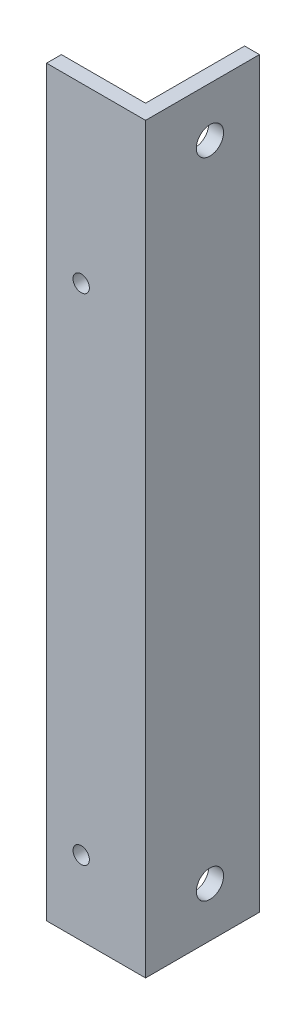
ISO-10303-21;
HEADER;
FILE_DESCRIPTION(('STEP AP214'),'2;1');
FILE_NAME('part.step','',(''),(''),'','','');
FILE_SCHEMA(('AUTOMOTIVE_DESIGN { 1 0 10303 214 1 1 1 1 }'));
ENDSEC;
DATA;
#1=APPLICATION_CONTEXT('core data for automotive mechanical design processes');
#2=APPLICATION_PROTOCOL_DEFINITION('international standard','automotive_design',2000,#1);
#3=PRODUCT_CONTEXT('',#1,'mechanical');
#4=PRODUCT('Part','Part','',(#3));
#5=PRODUCT_RELATED_PRODUCT_CATEGORY('part','',(#4));
#6=PRODUCT_DEFINITION_FORMATION('','',#4);
#7=PRODUCT_DEFINITION_CONTEXT('part definition',#1,'design');
#8=PRODUCT_DEFINITION('design','',#6,#7);
#9=PRODUCT_DEFINITION_SHAPE('','',#8);
#10=(LENGTH_UNIT() NAMED_UNIT(*) SI_UNIT(.MILLI.,.METRE.));
#11=(NAMED_UNIT(*) PLANE_ANGLE_UNIT() SI_UNIT($,.RADIAN.));
#12=(NAMED_UNIT(*) SI_UNIT($,.STERADIAN.) SOLID_ANGLE_UNIT());
#13=UNCERTAINTY_MEASURE_WITH_UNIT(LENGTH_MEASURE(1.E-05),#10,'distance_accuracy_value','');
#14=(GEOMETRIC_REPRESENTATION_CONTEXT(3) GLOBAL_UNCERTAINTY_ASSIGNED_CONTEXT((#13)) GLOBAL_UNIT_ASSIGNED_CONTEXT((#10,
#11,#12)) REPRESENTATION_CONTEXT('',''));
#15=CARTESIAN_POINT('',(0.,0.,0.));
#16=DIRECTION('',(0.,0.,1.));
#17=DIRECTION('',(1.,0.,0.));
#18=AXIS2_PLACEMENT_3D('',#15,#16,#17);
#19=CARTESIAN_POINT('',(52.,40.,-8.));
#20=DIRECTION('',(0.,0.,1.));
#21=DIRECTION('',(1.,0.,0.));
#22=AXIS2_PLACEMENT_3D('',#19,#20,#21);
#23=CYLINDRICAL_SURFACE('',#22,1.65);
#24=CARTESIAN_POINT('',(52.,40.,-4.));
#25=DIRECTION('',(0.,0.,1.));
#26=DIRECTION('',(1.,0.,0.));
#27=AXIS2_PLACEMENT_3D('',#24,#25,#26);
#28=CIRCLE('',#27,1.65);
#29=CARTESIAN_POINT('',(53.65,40.,-4.));
#30=VERTEX_POINT('',#29);
#31=EDGE_CURVE('E10',#30,#30,#28,.T.);
#32=ORIENTED_EDGE('',*,*,#31,.T.);
#33=EDGE_LOOP('',(#32));
#34=FACE_BOUND('',#33,.T.);
#35=CARTESIAN_POINT('',(52.,40.,-7.));
#36=DIRECTION('',(0.,0.,1.));
#37=DIRECTION('',(1.,0.,0.));
#38=AXIS2_PLACEMENT_3D('',#35,#36,#37);
#39=CIRCLE('',#38,1.65);
#40=CARTESIAN_POINT('',(53.65,40.,-7.));
#41=VERTEX_POINT('',#40);
#42=EDGE_CURVE('E156',#41,#41,#39,.T.);
#43=ORIENTED_EDGE('',*,*,#42,.F.);
#44=EDGE_LOOP('',(#43));
#45=FACE_BOUND('',#44,.T.);
#46=ADVANCED_FACE('F16',(#34,#45),#23,.F.);
#47=CARTESIAN_POINT('',(52.,-60.,-8.));
#48=DIRECTION('',(0.,0.,1.));
#49=DIRECTION('',(1.,0.,0.));
#50=AXIS2_PLACEMENT_3D('',#47,#48,#49);
#51=CYLINDRICAL_SURFACE('',#50,1.65);
#52=CARTESIAN_POINT('',(52.,-60.,-4.));
#53=DIRECTION('',(0.,0.,1.));
#54=DIRECTION('',(1.,0.,0.));
#55=AXIS2_PLACEMENT_3D('',#52,#53,#54);
#56=CIRCLE('',#55,1.65);
#57=CARTESIAN_POINT('',(53.65,-60.,-4.));
#58=VERTEX_POINT('',#57);
#59=EDGE_CURVE('E19',#58,#58,#56,.T.);
#60=ORIENTED_EDGE('',*,*,#59,.T.);
#61=EDGE_LOOP('',(#60));
#62=FACE_BOUND('',#61,.T.);
#63=CARTESIAN_POINT('',(52.,-60.,-7.));
#64=DIRECTION('',(0.,0.,1.));
#65=DIRECTION('',(1.,0.,0.));
#66=AXIS2_PLACEMENT_3D('',#63,#64,#65);
#67=CIRCLE('',#66,1.65);
#68=CARTESIAN_POINT('',(53.65,-60.,-7.));
#69=VERTEX_POINT('',#68);
#70=EDGE_CURVE('E94',#69,#69,#67,.T.);
#71=ORIENTED_EDGE('',*,*,#70,.F.);
#72=EDGE_LOOP('',(#71));
#73=FACE_BOUND('',#72,.T.);
#74=ADVANCED_FACE('F189',(#62,#73),#51,.F.);
#75=CARTESIAN_POINT('',(62.,-75.,-4.));
#76=DIRECTION('',(0.,0.,1.));
#77=DIRECTION('',(1.,0.,0.));
#78=AXIS2_PLACEMENT_3D('',#75,#76,#77);
#79=PLANE('',#78);
#80=ORIENTED_EDGE('',*,*,#31,.F.);
#81=EDGE_LOOP('',(#80));
#82=FACE_BOUND('',#81,.T.);
#83=ORIENTED_EDGE('',*,*,#59,.F.);
#84=EDGE_LOOP('',(#83));
#85=FACE_BOUND('',#84,.T.);
#86=DIRECTION('',(1.,0.,0.));
#87=VECTOR('',#86,1.);
#88=CARTESIAN_POINT('',(45.,75.,-4.));
#89=LINE('',#88,#87);
#90=CARTESIAN_POINT('',(45.,75.,-4.));
#91=VERTEX_POINT('',#90);
#92=CARTESIAN_POINT('',(65.,75.,-4.));
#93=VERTEX_POINT('',#92);
#94=EDGE_CURVE('E163',#91,#93,#89,.T.);
#95=ORIENTED_EDGE('',*,*,#94,.F.);
#96=DIRECTION('',(0.,1.,0.));
#97=VECTOR('',#96,1.);
#98=CARTESIAN_POINT('',(45.,-75.,-4.));
#99=LINE('',#98,#97);
#100=CARTESIAN_POINT('',(45.,-75.,-4.));
#101=VERTEX_POINT('',#100);
#102=EDGE_CURVE('E179',#101,#91,#99,.T.);
#103=ORIENTED_EDGE('',*,*,#102,.F.);
#104=DIRECTION('',(-1.,0.,0.));
#105=VECTOR('',#104,1.);
#106=CARTESIAN_POINT('',(65.,-75.,-4.));
#107=LINE('',#106,#105);
#108=CARTESIAN_POINT('',(65.,-75.,-4.));
#109=VERTEX_POINT('',#108);
#110=EDGE_CURVE('E118',#109,#101,#107,.T.);
#111=ORIENTED_EDGE('',*,*,#110,.F.);
#112=DIRECTION('',(0.,1.,0.));
#113=VECTOR('',#112,1.);
#114=CARTESIAN_POINT('',(65.,-75.,-4.));
#115=LINE('',#114,#113);
#116=EDGE_CURVE('E37',#109,#93,#115,.T.);
#117=ORIENTED_EDGE('',*,*,#116,.T.);
#118=EDGE_LOOP('',(#95,#103,#111,#117));
#119=FACE_BOUND('',#118,.T.);
#120=ADVANCED_FACE('F192',(#82,#85,#119),#79,.T.);
#121=CARTESIAN_POINT('',(45.,-75.,-7.));
#122=DIRECTION('',(1.,0.,0.));
#123=DIRECTION('',(0.,1.,0.));
#124=AXIS2_PLACEMENT_3D('',#121,#122,#123);
#125=PLANE('',#124);
#126=ORIENTED_EDGE('',*,*,#102,.T.);
#127=DIRECTION('',(0.,0.,1.));
#128=VECTOR('',#127,1.);
#129=CARTESIAN_POINT('',(45.,75.,-7.));
#130=LINE('',#129,#128);
#131=CARTESIAN_POINT('',(45.,75.,-7.));
#132=VERTEX_POINT('',#131);
#133=EDGE_CURVE('E160',#132,#91,#130,.T.);
#134=ORIENTED_EDGE('',*,*,#133,.F.);
#135=DIRECTION('',(0.,1.,0.));
#136=VECTOR('',#135,1.);
#137=CARTESIAN_POINT('',(45.,-75.,-7.));
#138=LINE('',#137,#136);
#139=CARTESIAN_POINT('',(45.,-75.,-7.));
#140=VERTEX_POINT('',#139);
#141=EDGE_CURVE('E90',#140,#132,#138,.T.);
#142=ORIENTED_EDGE('',*,*,#141,.F.);
#143=DIRECTION('',(0.,0.,1.));
#144=VECTOR('',#143,1.);
#145=CARTESIAN_POINT('',(45.,-75.,-7.));
#146=LINE('',#145,#144);
#147=EDGE_CURVE('E126',#140,#101,#146,.T.);
#148=ORIENTED_EDGE('',*,*,#147,.T.);
#149=EDGE_LOOP('',(#126,#134,#142,#148));
#150=FACE_BOUND('',#149,.T.);
#151=ADVANCED_FACE('F194',(#150),#125,.F.);
#152=CARTESIAN_POINT('',(65.,-75.,-27.));
#153=DIRECTION('',(1.,0.,0.));
#154=DIRECTION('',(0.,1.,0.));
#155=AXIS2_PLACEMENT_3D('',#152,#153,#154);
#156=PLANE('',#155);
#157=CARTESIAN_POINT('',(65.,-65.,-17.));
#158=DIRECTION('',(1.,0.,0.));
#159=DIRECTION('',(0.,0.,1.));
#160=AXIS2_PLACEMENT_3D('',#157,#158,#159);
#161=CIRCLE('',#160,2.75);
#162=CARTESIAN_POINT('',(65.,-65.,-14.25));
#163=VERTEX_POINT('',#162);
#164=EDGE_CURVE('E173',#163,#163,#161,.T.);
#165=ORIENTED_EDGE('',*,*,#164,.F.);
#166=EDGE_LOOP('',(#165));
#167=FACE_BOUND('',#166,.T.);
#168=CARTESIAN_POINT('',(65.,65.,-17.));
#169=DIRECTION('',(1.,0.,0.));
#170=DIRECTION('',(0.,0.,1.));
#171=AXIS2_PLACEMENT_3D('',#168,#169,#170);
#172=CIRCLE('',#171,2.75);
#173=CARTESIAN_POINT('',(65.,65.,-14.25));
#174=VERTEX_POINT('',#173);
#175=EDGE_CURVE('E170',#174,#174,#172,.T.);
#176=ORIENTED_EDGE('',*,*,#175,.F.);
#177=EDGE_LOOP('',(#176));
#178=FACE_BOUND('',#177,.T.);
#179=DIRECTION('',(0.,0.,1.));
#180=VECTOR('',#179,1.);
#181=CARTESIAN_POINT('',(65.,-75.,-27.));
#182=LINE('',#181,#180);
#183=CARTESIAN_POINT('',(65.,-75.,-27.));
#184=VERTEX_POINT('',#183);
#185=EDGE_CURVE('E120',#184,#109,#182,.T.);
#186=ORIENTED_EDGE('',*,*,#185,.F.);
#187=DIRECTION('',(0.,1.,0.));
#188=VECTOR('',#187,1.);
#189=CARTESIAN_POINT('',(65.,-75.,-27.));
#190=LINE('',#189,#188);
#191=CARTESIAN_POINT('',(65.,75.,-27.));
#192=VERTEX_POINT('',#191);
#193=EDGE_CURVE('E119',#184,#192,#190,.T.);
#194=ORIENTED_EDGE('',*,*,#193,.T.);
#195=DIRECTION('',(0.,0.,-1.));
#196=VECTOR('',#195,1.);
#197=CARTESIAN_POINT('',(65.,75.,-4.));
#198=LINE('',#197,#196);
#199=EDGE_CURVE('E167',#93,#192,#198,.T.);
#200=ORIENTED_EDGE('',*,*,#199,.F.);
#201=ORIENTED_EDGE('',*,*,#116,.F.);
#202=EDGE_LOOP('',(#186,#194,#200,#201));
#203=FACE_BOUND('',#202,.T.);
#204=ADVANCED_FACE('F205',(#167,#178,#203),#156,.T.);
#205=CARTESIAN_POINT('',(-70.,-65.,-17.));
#206=DIRECTION('',(1.,0.,0.));
#207=DIRECTION('',(0.,0.,1.));
#208=AXIS2_PLACEMENT_3D('',#205,#206,#207);
#209=CYLINDRICAL_SURFACE('',#208,2.75);
#210=ORIENTED_EDGE('',*,*,#164,.T.);
#211=EDGE_LOOP('',(#210));
#212=FACE_BOUND('',#211,.T.);
#213=CARTESIAN_POINT('',(62.,-65.,-17.));
#214=DIRECTION('',(1.,0.,0.));
#215=DIRECTION('',(0.,0.,1.));
#216=AXIS2_PLACEMENT_3D('',#213,#214,#215);
#217=CIRCLE('',#216,2.75);
#218=CARTESIAN_POINT('',(62.,-65.,-14.25));
#219=VERTEX_POINT('',#218);
#220=EDGE_CURVE('E138',#219,#219,#217,.T.);
#221=ORIENTED_EDGE('',*,*,#220,.F.);
#222=EDGE_LOOP('',(#221));
#223=FACE_BOUND('',#222,.T.);
#224=ADVANCED_FACE('F237',(#212,#223),#209,.F.);
#225=CARTESIAN_POINT('',(-70.,65.,-17.));
#226=DIRECTION('',(1.,0.,0.));
#227=DIRECTION('',(0.,0.,1.));
#228=AXIS2_PLACEMENT_3D('',#225,#226,#227);
#229=CYLINDRICAL_SURFACE('',#228,2.75);
#230=ORIENTED_EDGE('',*,*,#175,.T.);
#231=EDGE_LOOP('',(#230));
#232=FACE_BOUND('',#231,.T.);
#233=CARTESIAN_POINT('',(62.,65.,-17.));
#234=DIRECTION('',(1.,0.,0.));
#235=DIRECTION('',(0.,0.,1.));
#236=AXIS2_PLACEMENT_3D('',#233,#234,#235);
#237=CIRCLE('',#236,2.75);
#238=CARTESIAN_POINT('',(62.,65.,-14.25));
#239=VERTEX_POINT('',#238);
#240=EDGE_CURVE('E134',#239,#239,#237,.T.);
#241=ORIENTED_EDGE('',*,*,#240,.F.);
#242=EDGE_LOOP('',(#241));
#243=FACE_BOUND('',#242,.T.);
#244=ADVANCED_FACE('F234',(#232,#243),#229,.F.);
#245=CARTESIAN_POINT('',(62.,75.,-27.));
#246=DIRECTION('',(0.,1.,0.));
#247=DIRECTION('',(1.,0.,0.));
#248=AXIS2_PLACEMENT_3D('',#245,#246,#247);
#249=PLANE('',#248);
#250=DIRECTION('',(1.,0.,0.));
#251=VECTOR('',#250,1.);
#252=CARTESIAN_POINT('',(62.,75.,-27.));
#253=LINE('',#252,#251);
#254=CARTESIAN_POINT('',(62.,75.,-27.));
#255=VERTEX_POINT('',#254);
#256=EDGE_CURVE('E100',#255,#192,#253,.T.);
#257=ORIENTED_EDGE('',*,*,#256,.F.);
#258=DIRECTION('',(0.,0.,1.));
#259=VECTOR('',#258,1.);
#260=CARTESIAN_POINT('',(62.,75.,-27.));
#261=LINE('',#260,#259);
#262=CARTESIAN_POINT('',(62.,75.,-7.));
#263=VERTEX_POINT('',#262);
#264=EDGE_CURVE('E97',#255,#263,#261,.T.);
#265=ORIENTED_EDGE('',*,*,#264,.T.);
#266=DIRECTION('',(1.,0.,0.));
#267=VECTOR('',#266,1.);
#268=CARTESIAN_POINT('',(45.,75.,-7.));
#269=LINE('',#268,#267);
#270=EDGE_CURVE('E84',#132,#263,#269,.T.);
#271=ORIENTED_EDGE('',*,*,#270,.F.);
#272=ORIENTED_EDGE('',*,*,#133,.T.);
#273=ORIENTED_EDGE('',*,*,#94,.T.);
#274=ORIENTED_EDGE('',*,*,#199,.T.);
#275=EDGE_LOOP('',(#257,#265,#271,#272,#273,#274));
#276=FACE_BOUND('',#275,.T.);
#277=ADVANCED_FACE('F98',(#276),#249,.T.);
#278=CARTESIAN_POINT('',(45.,-75.,-7.));
#279=DIRECTION('',(0.,0.,1.));
#280=DIRECTION('',(1.,0.,0.));
#281=AXIS2_PLACEMENT_3D('',#278,#279,#280);
#282=PLANE('',#281);
#283=ORIENTED_EDGE('',*,*,#42,.T.);
#284=EDGE_LOOP('',(#283));
#285=FACE_BOUND('',#284,.T.);
#286=ORIENTED_EDGE('',*,*,#70,.T.);
#287=EDGE_LOOP('',(#286));
#288=FACE_BOUND('',#287,.T.);
#289=DIRECTION('',(0.,-1.,0.));
#290=VECTOR('',#289,1.);
#291=CARTESIAN_POINT('',(62.,-75.,-7.));
#292=LINE('',#291,#290);
#293=CARTESIAN_POINT('',(62.,-75.,-7.));
#294=VERTEX_POINT('',#293);
#295=EDGE_CURVE('E89',#263,#294,#292,.T.);
#296=ORIENTED_EDGE('',*,*,#295,.T.);
#297=DIRECTION('',(1.,0.,0.));
#298=VECTOR('',#297,1.);
#299=CARTESIAN_POINT('',(45.,-75.,-7.));
#300=LINE('',#299,#298);
#301=EDGE_CURVE('E122',#140,#294,#300,.T.);
#302=ORIENTED_EDGE('',*,*,#301,.F.);
#303=ORIENTED_EDGE('',*,*,#141,.T.);
#304=ORIENTED_EDGE('',*,*,#270,.T.);
#305=EDGE_LOOP('',(#296,#302,#303,#304));
#306=FACE_BOUND('',#305,.T.);
#307=ADVANCED_FACE('F86',(#285,#288,#306),#282,.F.);
#308=CARTESIAN_POINT('',(62.,-75.,-27.));
#309=DIRECTION('',(0.,0.,1.));
#310=DIRECTION('',(1.,0.,0.));
#311=AXIS2_PLACEMENT_3D('',#308,#309,#310);
#312=PLANE('',#311);
#313=ORIENTED_EDGE('',*,*,#256,.T.);
#314=ORIENTED_EDGE('',*,*,#193,.F.);
#315=DIRECTION('',(1.,0.,0.));
#316=VECTOR('',#315,1.);
#317=CARTESIAN_POINT('',(62.,-75.,-27.));
#318=LINE('',#317,#316);
#319=CARTESIAN_POINT('',(62.,-75.,-27.));
#320=VERTEX_POINT('',#319);
#321=EDGE_CURVE('E125',#320,#184,#318,.T.);
#322=ORIENTED_EDGE('',*,*,#321,.F.);
#323=DIRECTION('',(0.,1.,0.));
#324=VECTOR('',#323,1.);
#325=CARTESIAN_POINT('',(62.,-75.,-27.));
#326=LINE('',#325,#324);
#327=EDGE_CURVE('E105',#320,#255,#326,.T.);
#328=ORIENTED_EDGE('',*,*,#327,.T.);
#329=EDGE_LOOP('',(#313,#314,#322,#328));
#330=FACE_BOUND('',#329,.T.);
#331=ADVANCED_FACE('F207',(#330),#312,.F.);
#332=CARTESIAN_POINT('',(62.,-75.,-27.));
#333=DIRECTION('',(0.,1.,0.));
#334=DIRECTION('',(1.,0.,0.));
#335=AXIS2_PLACEMENT_3D('',#332,#333,#334);
#336=PLANE('',#335);
#337=ORIENTED_EDGE('',*,*,#110,.T.);
#338=ORIENTED_EDGE('',*,*,#147,.F.);
#339=ORIENTED_EDGE('',*,*,#301,.T.);
#340=DIRECTION('',(0.,0.,1.));
#341=VECTOR('',#340,1.);
#342=CARTESIAN_POINT('',(62.,-75.,-27.));
#343=LINE('',#342,#341);
#344=EDGE_CURVE('E110',#320,#294,#343,.T.);
#345=ORIENTED_EDGE('',*,*,#344,.F.);
#346=ORIENTED_EDGE('',*,*,#321,.T.);
#347=ORIENTED_EDGE('',*,*,#185,.T.);
#348=EDGE_LOOP('',(#337,#338,#339,#345,#346,#347));
#349=FACE_BOUND('',#348,.T.);
#350=ADVANCED_FACE('F199',(#349),#336,.F.);
#351=CARTESIAN_POINT('',(62.,-75.,-27.));
#352=DIRECTION('',(1.,0.,0.));
#353=DIRECTION('',(0.,1.,0.));
#354=AXIS2_PLACEMENT_3D('',#351,#352,#353);
#355=PLANE('',#354);
#356=ORIENTED_EDGE('',*,*,#220,.T.);
#357=EDGE_LOOP('',(#356));
#358=FACE_BOUND('',#357,.T.);
#359=ORIENTED_EDGE('',*,*,#240,.T.);
#360=EDGE_LOOP('',(#359));
#361=FACE_BOUND('',#360,.T.);
#362=ORIENTED_EDGE('',*,*,#295,.F.);
#363=ORIENTED_EDGE('',*,*,#264,.F.);
#364=ORIENTED_EDGE('',*,*,#327,.F.);
#365=ORIENTED_EDGE('',*,*,#344,.T.);
#366=EDGE_LOOP('',(#362,#363,#364,#365));
#367=FACE_BOUND('',#366,.T.);
#368=ADVANCED_FACE('F108',(#358,#361,#367),#355,.F.);
#369=CLOSED_SHELL('',(#46,#74,#120,#151,#204,#224,#244,#277,#307,#331,#350,#368));
#370=MANIFOLD_SOLID_BREP('B1',#369);
#371=ADVANCED_BREP_SHAPE_REPRESENTATION('',(#18,#370),#14);
#372=SHAPE_DEFINITION_REPRESENTATION(#9,#371);
ENDSEC;
END-ISO-10303-21;
